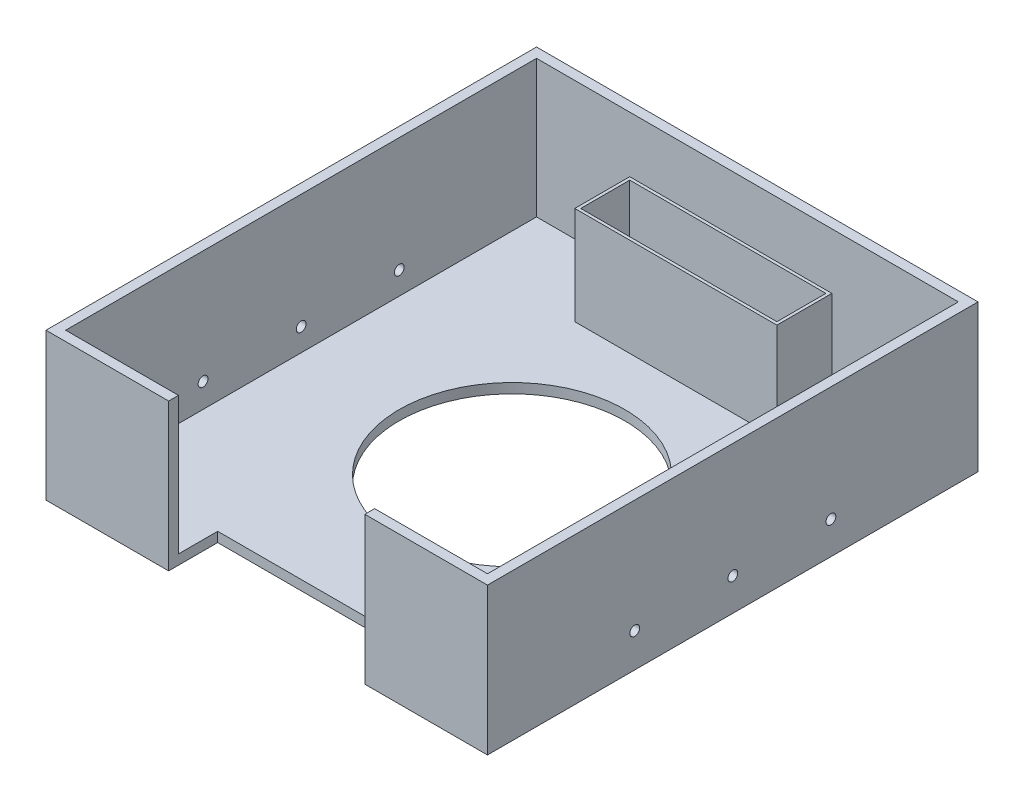
ISO-10303-21;
HEADER;
FILE_DESCRIPTION(('STEP AP214'),'2;1');
FILE_NAME('part.step','',(''),(''),'','','');
FILE_SCHEMA(('AUTOMOTIVE_DESIGN { 1 0 10303 214 1 1 1 1 }'));
ENDSEC;
DATA;
#1=APPLICATION_CONTEXT('core data for automotive mechanical design processes');
#2=APPLICATION_PROTOCOL_DEFINITION('international standard','automotive_design',2000,#1);
#3=PRODUCT_CONTEXT('',#1,'mechanical');
#4=PRODUCT('Part','Part','',(#3));
#5=PRODUCT_RELATED_PRODUCT_CATEGORY('part','',(#4));
#6=PRODUCT_DEFINITION_FORMATION('','',#4);
#7=PRODUCT_DEFINITION_CONTEXT('part definition',#1,'design');
#8=PRODUCT_DEFINITION('design','',#6,#7);
#9=PRODUCT_DEFINITION_SHAPE('','',#8);
#10=(LENGTH_UNIT() NAMED_UNIT(*) SI_UNIT(.MILLI.,.METRE.));
#11=(NAMED_UNIT(*) PLANE_ANGLE_UNIT() SI_UNIT($,.RADIAN.));
#12=(NAMED_UNIT(*) SI_UNIT($,.STERADIAN.) SOLID_ANGLE_UNIT());
#13=UNCERTAINTY_MEASURE_WITH_UNIT(LENGTH_MEASURE(1.E-05),#10,'distance_accuracy_value','');
#14=(GEOMETRIC_REPRESENTATION_CONTEXT(3) GLOBAL_UNCERTAINTY_ASSIGNED_CONTEXT((#13)) GLOBAL_UNIT_ASSIGNED_CONTEXT((#10,
#11,#12)) REPRESENTATION_CONTEXT('',''));
#15=CARTESIAN_POINT('',(0.,0.,0.));
#16=DIRECTION('',(0.,0.,1.));
#17=DIRECTION('',(1.,0.,0.));
#18=AXIS2_PLACEMENT_3D('',#15,#16,#17);
#19=CARTESIAN_POINT('',(0.,0.,0.));
#20=DIRECTION('',(0.,-1.,0.));
#21=DIRECTION('',(0.,0.,-1.));
#22=AXIS2_PLACEMENT_3D('',#19,#20,#21);
#23=PLANE('',#22);
#24=CARTESIAN_POINT('',(0.,0.,0.));
#25=DIRECTION('',(0.,1.,0.));
#26=DIRECTION('',(0.,0.,1.));
#27=AXIS2_PLACEMENT_3D('',#24,#25,#26);
#28=CIRCLE('',#27,115.);
#29=CARTESIAN_POINT('',(0.,0.,115.));
#30=VERTEX_POINT('',#29);
#31=EDGE_CURVE('E353',#30,#30,#28,.T.);
#32=ORIENTED_EDGE('',*,*,#31,.T.);
#33=EDGE_LOOP('',(#32));
#34=FACE_BOUND('',#33,.T.);
#35=DIRECTION('',(0.,0.,1.));
#36=VECTOR('',#35,1.);
#37=CARTESIAN_POINT('',(201.827871403571,0.,0.));
#38=LINE('',#37,#36);
#39=CARTESIAN_POINT('',(201.827871403571,0.,-145.964396687637));
#40=VERTEX_POINT('',#39);
#41=CARTESIAN_POINT('',(201.827871403571,0.,145.964396687637));
#42=VERTEX_POINT('',#41);
#43=EDGE_CURVE('E53',#40,#42,#38,.T.);
#44=ORIENTED_EDGE('',*,*,#43,.T.);
#45=DIRECTION('',(1.,0.,0.));
#46=VECTOR('',#45,1.);
#47=CARTESIAN_POINT('',(0.,0.,145.964396687637));
#48=LINE('',#47,#46);
#49=CARTESIAN_POINT('',(225.,0.,145.964396687637));
#50=VERTEX_POINT('',#49);
#51=EDGE_CURVE('E11',#42,#50,#48,.T.);
#52=ORIENTED_EDGE('',*,*,#51,.T.);
#53=DIRECTION('',(0.,0.,-1.));
#54=VECTOR('',#53,1.);
#55=CARTESIAN_POINT('',(225.,0.,250.));
#56=LINE('',#55,#54);
#57=CARTESIAN_POINT('',(225.,0.,250.));
#58=VERTEX_POINT('',#57);
#59=EDGE_CURVE('E405',#58,#50,#56,.T.);
#60=ORIENTED_EDGE('',*,*,#59,.F.);
#61=DIRECTION('',(1.,0.,0.));
#62=VECTOR('',#61,1.);
#63=CARTESIAN_POINT('',(-225.,0.,250.));
#64=LINE('',#63,#62);
#65=CARTESIAN_POINT('',(100.,0.,250.));
#66=VERTEX_POINT('',#65);
#67=EDGE_CURVE('E415',#66,#58,#64,.T.);
#68=ORIENTED_EDGE('',*,*,#67,.F.);
#69=DIRECTION('',(0.,0.,-1.));
#70=VECTOR('',#69,1.);
#71=CARTESIAN_POINT('',(100.,0.,300.));
#72=LINE('',#71,#70);
#73=CARTESIAN_POINT('',(100.,0.,200.));
#74=VERTEX_POINT('',#73);
#75=EDGE_CURVE('E325',#66,#74,#72,.T.);
#76=ORIENTED_EDGE('',*,*,#75,.T.);
#77=DIRECTION('',(-1.,0.,0.));
#78=VECTOR('',#77,1.);
#79=CARTESIAN_POINT('',(-100.,0.,200.));
#80=LINE('',#79,#78);
#81=CARTESIAN_POINT('',(-100.,0.,200.));
#82=VERTEX_POINT('',#81);
#83=EDGE_CURVE('E328',#74,#82,#80,.T.);
#84=ORIENTED_EDGE('',*,*,#83,.T.);
#85=DIRECTION('',(0.,0.,1.));
#86=VECTOR('',#85,1.);
#87=CARTESIAN_POINT('',(-100.,0.,300.));
#88=LINE('',#87,#86);
#89=CARTESIAN_POINT('',(-100.,0.,250.));
#90=VERTEX_POINT('',#89);
#91=EDGE_CURVE('E332',#82,#90,#88,.T.);
#92=ORIENTED_EDGE('',*,*,#91,.T.);
#93=CARTESIAN_POINT('',(-225.,0.,250.));
#94=VERTEX_POINT('',#93);
#95=EDGE_CURVE('E417',#94,#90,#64,.T.);
#96=ORIENTED_EDGE('',*,*,#95,.F.);
#97=DIRECTION('',(0.,0.,1.));
#98=VECTOR('',#97,1.);
#99=CARTESIAN_POINT('',(-225.,0.,250.));
#100=LINE('',#99,#98);
#101=CARTESIAN_POINT('',(-225.,0.,145.964396687637));
#102=VERTEX_POINT('',#101);
#103=EDGE_CURVE('E411',#102,#94,#100,.T.);
#104=ORIENTED_EDGE('',*,*,#103,.F.);
#105=DIRECTION('',(1.,0.,0.));
#106=VECTOR('',#105,1.);
#107=CARTESIAN_POINT('',(0.,0.,145.964396687637));
#108=LINE('',#107,#106);
#109=CARTESIAN_POINT('',(-201.827871403571,0.,145.964396687637));
#110=VERTEX_POINT('',#109);
#111=EDGE_CURVE('E447',#102,#110,#108,.T.);
#112=ORIENTED_EDGE('',*,*,#111,.T.);
#113=DIRECTION('',(0.,0.,-1.));
#114=VECTOR('',#113,1.);
#115=CARTESIAN_POINT('',(-201.827871403571,0.,0.));
#116=LINE('',#115,#114);
#117=CARTESIAN_POINT('',(-201.827871403571,0.,-145.964396687637));
#118=VERTEX_POINT('',#117);
#119=EDGE_CURVE('E444',#110,#118,#116,.T.);
#120=ORIENTED_EDGE('',*,*,#119,.T.);
#121=DIRECTION('',(-1.,0.,0.));
#122=VECTOR('',#121,1.);
#123=CARTESIAN_POINT('',(0.,0.,-145.964396687637));
#124=LINE('',#123,#122);
#125=CARTESIAN_POINT('',(-225.,0.,-145.964396687637));
#126=VERTEX_POINT('',#125);
#127=EDGE_CURVE('E441',#118,#126,#124,.T.);
#128=ORIENTED_EDGE('',*,*,#127,.T.);
#129=CARTESIAN_POINT('',(-225.,0.,-250.));
#130=VERTEX_POINT('',#129);
#131=EDGE_CURVE('E412',#130,#126,#100,.T.);
#132=ORIENTED_EDGE('',*,*,#131,.F.);
#133=DIRECTION('',(-1.,0.,0.));
#134=VECTOR('',#133,1.);
#135=CARTESIAN_POINT('',(-225.,0.,-250.));
#136=LINE('',#135,#134);
#137=CARTESIAN_POINT('',(225.,0.,-250.));
#138=VERTEX_POINT('',#137);
#139=EDGE_CURVE('E408',#138,#130,#136,.T.);
#140=ORIENTED_EDGE('',*,*,#139,.F.);
#141=CARTESIAN_POINT('',(225.,0.,-145.964396687637));
#142=VERTEX_POINT('',#141);
#143=EDGE_CURVE('E404',#142,#138,#56,.T.);
#144=ORIENTED_EDGE('',*,*,#143,.F.);
#145=DIRECTION('',(-1.,0.,0.));
#146=VECTOR('',#145,1.);
#147=CARTESIAN_POINT('',(0.,0.,-145.964396687637));
#148=LINE('',#147,#146);
#149=EDGE_CURVE('E450',#142,#40,#148,.T.);
#150=ORIENTED_EDGE('',*,*,#149,.T.);
#151=EDGE_LOOP('',(#44,#52,#60,#68,#76,#84,#92,#96,#104,#112,#120,#128,#132,#140,#144,#150));
#152=FACE_BOUND('',#151,.T.);
#153=ADVANCED_FACE('F44',(#34,#152),#23,.T.);
#154=ORIENTED_EDGE('',*,*,#51,.F.);
#155=ORIENTED_EDGE('',*,*,#43,.F.);
#156=ORIENTED_EDGE('',*,*,#149,.F.);
#157=EDGE_CURVE('E409',#50,#142,#56,.T.);
#158=ORIENTED_EDGE('',*,*,#157,.F.);
#159=EDGE_LOOP('',(#154,#155,#156,#158));
#160=FACE_BOUND('',#159,.T.);
#161=ADVANCED_FACE('F460',(#160),#23,.T.);
#162=CARTESIAN_POINT('',(0.,10.,0.));
#163=DIRECTION('',(0.,-1.,0.));
#164=DIRECTION('',(0.,0.,-1.));
#165=AXIS2_PLACEMENT_3D('',#162,#163,#164);
#166=PLANE('',#165);
#167=CARTESIAN_POINT('',(0.,10.,0.));
#168=DIRECTION('',(0.,1.,0.));
#169=DIRECTION('',(0.,0.,1.));
#170=AXIS2_PLACEMENT_3D('',#167,#168,#169);
#171=CIRCLE('',#170,115.);
#172=CARTESIAN_POINT('',(0.,10.,115.));
#173=VERTEX_POINT('',#172);
#174=EDGE_CURVE('E352',#173,#173,#171,.T.);
#175=ORIENTED_EDGE('',*,*,#174,.F.);
#176=EDGE_LOOP('',(#175));
#177=FACE_BOUND('',#176,.T.);
#178=DIRECTION('',(1.,0.,0.));
#179=VECTOR('',#178,1.);
#180=CARTESIAN_POINT('',(0.,10.,200.));
#181=LINE('',#180,#179);
#182=CARTESIAN_POINT('',(-100.,10.,200.));
#183=VERTEX_POINT('',#182);
#184=CARTESIAN_POINT('',(100.,10.,200.));
#185=VERTEX_POINT('',#184);
#186=EDGE_CURVE('E432',#183,#185,#181,.T.);
#187=ORIENTED_EDGE('',*,*,#186,.T.);
#188=DIRECTION('',(0.,0.,1.));
#189=VECTOR('',#188,1.);
#190=CARTESIAN_POINT('',(100.,10.,0.));
#191=LINE('',#190,#189);
#192=CARTESIAN_POINT('',(100.,10.,240.));
#193=VERTEX_POINT('',#192);
#194=EDGE_CURVE('E438',#185,#193,#191,.T.);
#195=ORIENTED_EDGE('',*,*,#194,.T.);
#196=DIRECTION('',(1.,0.,0.));
#197=VECTOR('',#196,1.);
#198=CARTESIAN_POINT('',(-215.,10.,240.));
#199=LINE('',#198,#197);
#200=CARTESIAN_POINT('',(215.,10.,240.));
#201=VERTEX_POINT('',#200);
#202=EDGE_CURVE('E356',#193,#201,#199,.T.);
#203=ORIENTED_EDGE('',*,*,#202,.T.);
#204=DIRECTION('',(0.,0.,-1.));
#205=VECTOR('',#204,1.);
#206=CARTESIAN_POINT('',(215.,10.,240.));
#207=LINE('',#206,#205);
#208=CARTESIAN_POINT('',(215.,10.,-240.));
#209=VERTEX_POINT('',#208);
#210=EDGE_CURVE('E374',#201,#209,#207,.T.);
#211=ORIENTED_EDGE('',*,*,#210,.T.);
#212=DIRECTION('',(-1.,0.,0.));
#213=VECTOR('',#212,1.);
#214=CARTESIAN_POINT('',(215.,10.,-240.));
#215=LINE('',#214,#213);
#216=CARTESIAN_POINT('',(-215.,10.,-240.));
#217=VERTEX_POINT('',#216);
#218=EDGE_CURVE('E377',#209,#217,#215,.T.);
#219=ORIENTED_EDGE('',*,*,#218,.T.);
#220=DIRECTION('',(0.,0.,1.));
#221=VECTOR('',#220,1.);
#222=CARTESIAN_POINT('',(-215.,10.,-240.));
#223=LINE('',#222,#221);
#224=CARTESIAN_POINT('',(-215.,10.,240.));
#225=VERTEX_POINT('',#224);
#226=EDGE_CURVE('E380',#217,#225,#223,.T.);
#227=ORIENTED_EDGE('',*,*,#226,.T.);
#228=CARTESIAN_POINT('',(-100.,10.,240.));
#229=VERTEX_POINT('',#228);
#230=EDGE_CURVE('E371',#225,#229,#199,.T.);
#231=ORIENTED_EDGE('',*,*,#230,.T.);
#232=DIRECTION('',(0.,0.,-1.));
#233=VECTOR('',#232,1.);
#234=CARTESIAN_POINT('',(-100.,10.,0.));
#235=LINE('',#234,#233);
#236=EDGE_CURVE('E435',#229,#183,#235,.T.);
#237=ORIENTED_EDGE('',*,*,#236,.T.);
#238=EDGE_LOOP('',(#187,#195,#203,#211,#219,#227,#231,#237));
#239=FACE_BOUND('',#238,.T.);
#240=DIRECTION('',(0.,0.,1.));
#241=VECTOR('',#240,1.);
#242=CARTESIAN_POINT('',(-103.,10.,-223.));
#243=LINE('',#242,#241);
#244=CARTESIAN_POINT('',(-103.,10.,-223.));
#245=VERTEX_POINT('',#244);
#246=CARTESIAN_POINT('',(-103.,10.,-167.));
#247=VERTEX_POINT('',#246);
#248=EDGE_CURVE('E232',#245,#247,#243,.T.);
#249=ORIENTED_EDGE('',*,*,#248,.F.);
#250=DIRECTION('',(-1.,0.,0.));
#251=VECTOR('',#250,1.);
#252=CARTESIAN_POINT('',(-103.,10.,-223.));
#253=LINE('',#252,#251);
#254=CARTESIAN_POINT('',(103.,10.,-223.));
#255=VERTEX_POINT('',#254);
#256=EDGE_CURVE('E260',#255,#245,#253,.T.);
#257=ORIENTED_EDGE('',*,*,#256,.F.);
#258=DIRECTION('',(0.,0.,-1.));
#259=VECTOR('',#258,1.);
#260=CARTESIAN_POINT('',(103.,10.,-223.));
#261=LINE('',#260,#259);
#262=CARTESIAN_POINT('',(103.,10.,-167.));
#263=VERTEX_POINT('',#262);
#264=EDGE_CURVE('E272',#263,#255,#261,.T.);
#265=ORIENTED_EDGE('',*,*,#264,.F.);
#266=DIRECTION('',(1.,0.,0.));
#267=VECTOR('',#266,1.);
#268=CARTESIAN_POINT('',(-103.,10.,-167.));
#269=LINE('',#268,#267);
#270=EDGE_CURVE('E269',#247,#263,#269,.T.);
#271=ORIENTED_EDGE('',*,*,#270,.F.);
#272=EDGE_LOOP('',(#249,#257,#265,#271));
#273=FACE_BOUND('',#272,.T.);
#274=ADVANCED_FACE('F487',(#177,#239,#273),#166,.F.);
#275=CARTESIAN_POINT('',(-225.,10.,250.));
#276=DIRECTION('',(0.,0.,-1.));
#277=DIRECTION('',(-1.,0.,0.));
#278=AXIS2_PLACEMENT_3D('',#275,#276,#277);
#279=PLANE('',#278);
#280=DIRECTION('',(1.,0.,0.));
#281=VECTOR('',#280,1.);
#282=CARTESIAN_POINT('',(-225.,150.,250.));
#283=LINE('',#282,#281);
#284=CARTESIAN_POINT('',(100.,150.,250.));
#285=VERTEX_POINT('',#284);
#286=CARTESIAN_POINT('',(225.,150.,250.));
#287=VERTEX_POINT('',#286);
#288=EDGE_CURVE('E391',#285,#287,#283,.T.);
#289=ORIENTED_EDGE('',*,*,#288,.F.);
#290=DIRECTION('',(0.,-1.,0.));
#291=VECTOR('',#290,1.);
#292=CARTESIAN_POINT('',(99.9999999999999,10.,250.));
#293=LINE('',#292,#291);
#294=EDGE_CURVE('E349',#285,#66,#293,.T.);
#295=ORIENTED_EDGE('',*,*,#294,.T.);
#296=ORIENTED_EDGE('',*,*,#67,.T.);
#297=DIRECTION('',(0.,-1.,0.));
#298=VECTOR('',#297,1.);
#299=CARTESIAN_POINT('',(225.,10.,250.));
#300=LINE('',#299,#298);
#301=EDGE_CURVE('E420',#287,#58,#300,.T.);
#302=ORIENTED_EDGE('',*,*,#301,.F.);
#303=EDGE_LOOP('',(#289,#295,#296,#302));
#304=FACE_BOUND('',#303,.T.);
#305=ADVANCED_FACE('F467',(#304),#279,.F.);
#306=CARTESIAN_POINT('',(-215.,150.,240.));
#307=DIRECTION('',(0.,0.,-1.));
#308=DIRECTION('',(-1.,0.,0.));
#309=AXIS2_PLACEMENT_3D('',#306,#307,#308);
#310=PLANE('',#309);
#311=DIRECTION('',(0.,-1.,0.));
#312=VECTOR('',#311,1.);
#313=CARTESIAN_POINT('',(99.9999999999999,150.,240.));
#314=LINE('',#313,#312);
#315=CARTESIAN_POINT('',(100.,150.,240.));
#316=VERTEX_POINT('',#315);
#317=EDGE_CURVE('E347',#316,#193,#314,.T.);
#318=ORIENTED_EDGE('',*,*,#317,.F.);
#319=DIRECTION('',(1.,0.,0.));
#320=VECTOR('',#319,1.);
#321=CARTESIAN_POINT('',(-215.,150.,240.));
#322=LINE('',#321,#320);
#323=CARTESIAN_POINT('',(215.,150.,240.));
#324=VERTEX_POINT('',#323);
#325=EDGE_CURVE('E363',#316,#324,#322,.T.);
#326=ORIENTED_EDGE('',*,*,#325,.T.);
#327=DIRECTION('',(0.,-1.,0.));
#328=VECTOR('',#327,1.);
#329=CARTESIAN_POINT('',(215.,150.,240.));
#330=LINE('',#329,#328);
#331=EDGE_CURVE('E388',#324,#201,#330,.T.);
#332=ORIENTED_EDGE('',*,*,#331,.T.);
#333=ORIENTED_EDGE('',*,*,#202,.F.);
#334=EDGE_LOOP('',(#318,#326,#332,#333));
#335=FACE_BOUND('',#334,.T.);
#336=ADVANCED_FACE('F479',(#335),#310,.T.);
#337=CARTESIAN_POINT('',(225.,10.,250.));
#338=DIRECTION('',(-1.,0.,0.));
#339=DIRECTION('',(0.,0.,1.));
#340=AXIS2_PLACEMENT_3D('',#337,#338,#339);
#341=PLANE('',#340);
#342=CARTESIAN_POINT('',(225.,34.7,99.9));
#343=DIRECTION('',(1.,0.,0.));
#344=DIRECTION('',(0.,0.,-1.));
#345=AXIS2_PLACEMENT_3D('',#342,#343,#344);
#346=CIRCLE('',#345,5.00000000000001);
#347=CARTESIAN_POINT('',(225.,34.7,94.9));
#348=VERTEX_POINT('',#347);
#349=EDGE_CURVE('E311',#348,#348,#346,.T.);
#350=ORIENTED_EDGE('',*,*,#349,.F.);
#351=EDGE_LOOP('',(#350));
#352=FACE_BOUND('',#351,.T.);
#353=CARTESIAN_POINT('',(225.,33.13,-0.100000000000017));
#354=DIRECTION('',(1.,0.,0.));
#355=DIRECTION('',(0.,0.,-1.));
#356=AXIS2_PLACEMENT_3D('',#353,#354,#355);
#357=CIRCLE('',#356,5.);
#358=CARTESIAN_POINT('',(225.,33.13,-5.10000000000002));
#359=VERTEX_POINT('',#358);
#360=EDGE_CURVE('E317',#359,#359,#357,.T.);
#361=ORIENTED_EDGE('',*,*,#360,.F.);
#362=EDGE_LOOP('',(#361));
#363=FACE_BOUND('',#362,.T.);
#364=CARTESIAN_POINT('',(225.,33.13,-100.1));
#365=DIRECTION('',(1.,0.,0.));
#366=DIRECTION('',(0.,0.,-1.));
#367=AXIS2_PLACEMENT_3D('',#364,#365,#366);
#368=CIRCLE('',#367,5.00000000000001);
#369=CARTESIAN_POINT('',(225.,33.13,-105.1));
#370=VERTEX_POINT('',#369);
#371=EDGE_CURVE('E304',#370,#370,#368,.T.);
#372=ORIENTED_EDGE('',*,*,#371,.F.);
#373=EDGE_LOOP('',(#372));
#374=FACE_BOUND('',#373,.T.);
#375=ORIENTED_EDGE('',*,*,#59,.T.);
#376=ORIENTED_EDGE('',*,*,#157,.T.);
#377=ORIENTED_EDGE('',*,*,#143,.T.);
#378=DIRECTION('',(0.,-1.,0.));
#379=VECTOR('',#378,1.);
#380=CARTESIAN_POINT('',(225.,10.,-250.));
#381=LINE('',#380,#379);
#382=CARTESIAN_POINT('',(225.,150.,-250.));
#383=VERTEX_POINT('',#382);
#384=EDGE_CURVE('E429',#383,#138,#381,.T.);
#385=ORIENTED_EDGE('',*,*,#384,.F.);
#386=DIRECTION('',(0.,0.,-1.));
#387=VECTOR('',#386,1.);
#388=CARTESIAN_POINT('',(225.,150.,250.));
#389=LINE('',#388,#387);
#390=EDGE_CURVE('E395',#287,#383,#389,.T.);
#391=ORIENTED_EDGE('',*,*,#390,.F.);
#392=ORIENTED_EDGE('',*,*,#301,.T.);
#393=EDGE_LOOP('',(#375,#376,#377,#385,#391,#392));
#394=FACE_BOUND('',#393,.T.);
#395=ADVANCED_FACE('F46',(#352,#363,#374,#394),#341,.F.);
#396=CARTESIAN_POINT('',(-225.,10.,-250.));
#397=DIRECTION('',(0.,0.,1.));
#398=DIRECTION('',(1.,0.,0.));
#399=AXIS2_PLACEMENT_3D('',#396,#397,#398);
#400=PLANE('',#399);
#401=ORIENTED_EDGE('',*,*,#139,.T.);
#402=DIRECTION('',(0.,-1.,0.));
#403=VECTOR('',#402,1.);
#404=CARTESIAN_POINT('',(-225.,10.,-250.));
#405=LINE('',#404,#403);
#406=CARTESIAN_POINT('',(-225.,150.,-250.));
#407=VERTEX_POINT('',#406);
#408=EDGE_CURVE('E426',#407,#130,#405,.T.);
#409=ORIENTED_EDGE('',*,*,#408,.F.);
#410=DIRECTION('',(-1.,0.,0.));
#411=VECTOR('',#410,1.);
#412=CARTESIAN_POINT('',(225.,150.,-250.));
#413=LINE('',#412,#411);
#414=EDGE_CURVE('E398',#383,#407,#413,.T.);
#415=ORIENTED_EDGE('',*,*,#414,.F.);
#416=ORIENTED_EDGE('',*,*,#384,.T.);
#417=EDGE_LOOP('',(#401,#409,#415,#416));
#418=FACE_BOUND('',#417,.T.);
#419=ADVANCED_FACE('F507',(#418),#400,.F.);
#420=CARTESIAN_POINT('',(-225.,10.,250.));
#421=DIRECTION('',(1.,0.,0.));
#422=DIRECTION('',(0.,0.,-1.));
#423=AXIS2_PLACEMENT_3D('',#420,#421,#422);
#424=PLANE('',#423);
#425=CARTESIAN_POINT('',(-225.,33.13,-100.1));
#426=DIRECTION('',(-1.,0.,0.));
#427=DIRECTION('',(0.,0.,1.));
#428=AXIS2_PLACEMENT_3D('',#425,#426,#427);
#429=CIRCLE('',#428,5.00000000000001);
#430=CARTESIAN_POINT('',(-225.,33.13,-95.1));
#431=VERTEX_POINT('',#430);
#432=EDGE_CURVE('E288',#431,#431,#429,.T.);
#433=ORIENTED_EDGE('',*,*,#432,.F.);
#434=EDGE_LOOP('',(#433));
#435=FACE_BOUND('',#434,.T.);
#436=CARTESIAN_POINT('',(-225.,34.7,99.9));
#437=DIRECTION('',(-1.,0.,0.));
#438=DIRECTION('',(0.,0.,1.));
#439=AXIS2_PLACEMENT_3D('',#436,#437,#438);
#440=CIRCLE('',#439,5.00000000000001);
#441=CARTESIAN_POINT('',(-225.,34.7,104.9));
#442=VERTEX_POINT('',#441);
#443=EDGE_CURVE('E293',#442,#442,#440,.T.);
#444=ORIENTED_EDGE('',*,*,#443,.F.);
#445=EDGE_LOOP('',(#444));
#446=FACE_BOUND('',#445,.T.);
#447=CARTESIAN_POINT('',(-225.,33.13,-0.100000000000017));
#448=DIRECTION('',(-1.,0.,0.));
#449=DIRECTION('',(0.,0.,1.));
#450=AXIS2_PLACEMENT_3D('',#447,#448,#449);
#451=CIRCLE('',#450,5.00000000000001);
#452=CARTESIAN_POINT('',(-225.,33.13,4.89999999999999));
#453=VERTEX_POINT('',#452);
#454=EDGE_CURVE('E292',#453,#453,#451,.T.);
#455=ORIENTED_EDGE('',*,*,#454,.F.);
#456=EDGE_LOOP('',(#455));
#457=FACE_BOUND('',#456,.T.);
#458=ORIENTED_EDGE('',*,*,#131,.T.);
#459=EDGE_CURVE('E416',#126,#102,#100,.T.);
#460=ORIENTED_EDGE('',*,*,#459,.T.);
#461=ORIENTED_EDGE('',*,*,#103,.T.);
#462=DIRECTION('',(0.,-1.,0.));
#463=VECTOR('',#462,1.);
#464=CARTESIAN_POINT('',(-225.,10.,250.));
#465=LINE('',#464,#463);
#466=CARTESIAN_POINT('',(-225.,150.,250.));
#467=VERTEX_POINT('',#466);
#468=EDGE_CURVE('E423',#467,#94,#465,.T.);
#469=ORIENTED_EDGE('',*,*,#468,.F.);
#470=DIRECTION('',(0.,0.,1.));
#471=VECTOR('',#470,1.);
#472=CARTESIAN_POINT('',(-225.,150.,-250.));
#473=LINE('',#472,#471);
#474=EDGE_CURVE('E401',#407,#467,#473,.T.);
#475=ORIENTED_EDGE('',*,*,#474,.F.);
#476=ORIENTED_EDGE('',*,*,#408,.T.);
#477=EDGE_LOOP('',(#458,#460,#461,#469,#475,#476));
#478=FACE_BOUND('',#477,.T.);
#479=ADVANCED_FACE('F502',(#435,#446,#457,#478),#424,.F.);
#480=ORIENTED_EDGE('',*,*,#95,.T.);
#481=DIRECTION('',(0.,1.,0.));
#482=VECTOR('',#481,1.);
#483=CARTESIAN_POINT('',(-100.,10.,250.));
#484=LINE('',#483,#482);
#485=CARTESIAN_POINT('',(-100.,150.,250.));
#486=VERTEX_POINT('',#485);
#487=EDGE_CURVE('E344',#90,#486,#484,.T.);
#488=ORIENTED_EDGE('',*,*,#487,.T.);
#489=EDGE_CURVE('E392',#467,#486,#283,.T.);
#490=ORIENTED_EDGE('',*,*,#489,.F.);
#491=ORIENTED_EDGE('',*,*,#468,.T.);
#492=EDGE_LOOP('',(#480,#488,#490,#491));
#493=FACE_BOUND('',#492,.T.);
#494=ADVANCED_FACE('F498',(#493),#279,.F.);
#495=ORIENTED_EDGE('',*,*,#111,.F.);
#496=ORIENTED_EDGE('',*,*,#459,.F.);
#497=ORIENTED_EDGE('',*,*,#127,.F.);
#498=ORIENTED_EDGE('',*,*,#119,.F.);
#499=EDGE_LOOP('',(#495,#496,#497,#498));
#500=FACE_BOUND('',#499,.T.);
#501=ADVANCED_FACE('F513',(#500),#23,.T.);
#502=CARTESIAN_POINT('',(0.,150.,0.));
#503=DIRECTION('',(0.,1.,0.));
#504=DIRECTION('',(0.,0.,1.));
#505=AXIS2_PLACEMENT_3D('',#502,#503,#504);
#506=PLANE('',#505);
#507=DIRECTION('',(0.,0.,-1.));
#508=VECTOR('',#507,1.);
#509=CARTESIAN_POINT('',(100.,150.,300.));
#510=LINE('',#509,#508);
#511=EDGE_CURVE('E310',#285,#316,#510,.T.);
#512=ORIENTED_EDGE('',*,*,#511,.F.);
#513=ORIENTED_EDGE('',*,*,#288,.T.);
#514=ORIENTED_EDGE('',*,*,#390,.T.);
#515=ORIENTED_EDGE('',*,*,#414,.T.);
#516=ORIENTED_EDGE('',*,*,#474,.T.);
#517=ORIENTED_EDGE('',*,*,#489,.T.);
#518=DIRECTION('',(0.,0.,1.));
#519=VECTOR('',#518,1.);
#520=CARTESIAN_POINT('',(-100.,150.,300.));
#521=LINE('',#520,#519);
#522=CARTESIAN_POINT('',(-100.,150.,240.));
#523=VERTEX_POINT('',#522);
#524=EDGE_CURVE('E329',#523,#486,#521,.T.);
#525=ORIENTED_EDGE('',*,*,#524,.F.);
#526=CARTESIAN_POINT('',(-215.,150.,240.));
#527=VERTEX_POINT('',#526);
#528=EDGE_CURVE('E359',#527,#523,#322,.T.);
#529=ORIENTED_EDGE('',*,*,#528,.F.);
#530=DIRECTION('',(0.,0.,1.));
#531=VECTOR('',#530,1.);
#532=CARTESIAN_POINT('',(-215.,150.,-240.));
#533=LINE('',#532,#531);
#534=CARTESIAN_POINT('',(-215.,150.,-240.));
#535=VERTEX_POINT('',#534);
#536=EDGE_CURVE('E368',#535,#527,#533,.T.);
#537=ORIENTED_EDGE('',*,*,#536,.F.);
#538=DIRECTION('',(-1.,0.,0.));
#539=VECTOR('',#538,1.);
#540=CARTESIAN_POINT('',(215.,150.,-240.));
#541=LINE('',#540,#539);
#542=CARTESIAN_POINT('',(215.,150.,-240.));
#543=VERTEX_POINT('',#542);
#544=EDGE_CURVE('E365',#543,#535,#541,.T.);
#545=ORIENTED_EDGE('',*,*,#544,.F.);
#546=DIRECTION('',(0.,0.,-1.));
#547=VECTOR('',#546,1.);
#548=CARTESIAN_POINT('',(215.,150.,240.));
#549=LINE('',#548,#547);
#550=EDGE_CURVE('E362',#324,#543,#549,.T.);
#551=ORIENTED_EDGE('',*,*,#550,.F.);
#552=ORIENTED_EDGE('',*,*,#325,.F.);
#553=EDGE_LOOP('',(#512,#513,#514,#515,#516,#517,#525,#529,#537,#545,#551,#552));
#554=FACE_BOUND('',#553,.T.);
#555=ADVANCED_FACE('F474',(#554),#506,.T.);
#556=DIRECTION('',(0.,1.,0.));
#557=VECTOR('',#556,1.);
#558=CARTESIAN_POINT('',(-100.,150.,240.));
#559=LINE('',#558,#557);
#560=EDGE_CURVE('E341',#229,#523,#559,.T.);
#561=ORIENTED_EDGE('',*,*,#560,.F.);
#562=ORIENTED_EDGE('',*,*,#230,.F.);
#563=DIRECTION('',(0.,-1.,0.));
#564=VECTOR('',#563,1.);
#565=CARTESIAN_POINT('',(-215.,150.,240.));
#566=LINE('',#565,#564);
#567=EDGE_CURVE('E370',#527,#225,#566,.T.);
#568=ORIENTED_EDGE('',*,*,#567,.F.);
#569=ORIENTED_EDGE('',*,*,#528,.T.);
#570=EDGE_LOOP('',(#561,#562,#568,#569));
#571=FACE_BOUND('',#570,.T.);
#572=ADVANCED_FACE('F520',(#571),#310,.T.);
#573=CARTESIAN_POINT('',(215.,150.,240.));
#574=DIRECTION('',(-1.,0.,0.));
#575=DIRECTION('',(0.,0.,1.));
#576=AXIS2_PLACEMENT_3D('',#573,#574,#575);
#577=PLANE('',#576);
#578=CARTESIAN_POINT('',(215.,34.7,99.9));
#579=DIRECTION('',(1.,0.,0.));
#580=DIRECTION('',(0.,0.,-1.));
#581=AXIS2_PLACEMENT_3D('',#578,#579,#580);
#582=CIRCLE('',#581,5.00000000000001);
#583=CARTESIAN_POINT('',(215.,34.7,94.9));
#584=VERTEX_POINT('',#583);
#585=EDGE_CURVE('E307',#584,#584,#582,.T.);
#586=ORIENTED_EDGE('',*,*,#585,.T.);
#587=EDGE_LOOP('',(#586));
#588=FACE_BOUND('',#587,.T.);
#589=CARTESIAN_POINT('',(215.,33.13,-0.100000000000017));
#590=DIRECTION('',(1.,0.,0.));
#591=DIRECTION('',(0.,0.,-1.));
#592=AXIS2_PLACEMENT_3D('',#589,#590,#591);
#593=CIRCLE('',#592,5.);
#594=CARTESIAN_POINT('',(215.,33.13,-5.10000000000002));
#595=VERTEX_POINT('',#594);
#596=EDGE_CURVE('E314',#595,#595,#593,.T.);
#597=ORIENTED_EDGE('',*,*,#596,.T.);
#598=EDGE_LOOP('',(#597));
#599=FACE_BOUND('',#598,.T.);
#600=CARTESIAN_POINT('',(215.,33.13,-100.1));
#601=DIRECTION('',(1.,0.,0.));
#602=DIRECTION('',(0.,0.,-1.));
#603=AXIS2_PLACEMENT_3D('',#600,#601,#602);
#604=CIRCLE('',#603,5.00000000000001);
#605=CARTESIAN_POINT('',(215.,33.13,-105.1));
#606=VERTEX_POINT('',#605);
#607=EDGE_CURVE('E320',#606,#606,#604,.T.);
#608=ORIENTED_EDGE('',*,*,#607,.T.);
#609=EDGE_LOOP('',(#608));
#610=FACE_BOUND('',#609,.T.);
#611=ORIENTED_EDGE('',*,*,#210,.F.);
#612=ORIENTED_EDGE('',*,*,#331,.F.);
#613=ORIENTED_EDGE('',*,*,#550,.T.);
#614=DIRECTION('',(0.,-1.,0.));
#615=VECTOR('',#614,1.);
#616=CARTESIAN_POINT('',(215.,150.,-240.));
#617=LINE('',#616,#615);
#618=EDGE_CURVE('E386',#543,#209,#617,.T.);
#619=ORIENTED_EDGE('',*,*,#618,.T.);
#620=EDGE_LOOP('',(#611,#612,#613,#619));
#621=FACE_BOUND('',#620,.T.);
#622=ADVANCED_FACE('F483',(#588,#599,#610,#621),#577,.T.);
#623=CARTESIAN_POINT('',(215.,150.,-240.));
#624=DIRECTION('',(0.,0.,1.));
#625=DIRECTION('',(1.,0.,0.));
#626=AXIS2_PLACEMENT_3D('',#623,#624,#625);
#627=PLANE('',#626);
#628=ORIENTED_EDGE('',*,*,#218,.F.);
#629=ORIENTED_EDGE('',*,*,#618,.F.);
#630=ORIENTED_EDGE('',*,*,#544,.T.);
#631=DIRECTION('',(0.,-1.,0.));
#632=VECTOR('',#631,1.);
#633=CARTESIAN_POINT('',(-215.,150.,-240.));
#634=LINE('',#633,#632);
#635=EDGE_CURVE('E384',#535,#217,#634,.T.);
#636=ORIENTED_EDGE('',*,*,#635,.T.);
#637=EDGE_LOOP('',(#628,#629,#630,#636));
#638=FACE_BOUND('',#637,.T.);
#639=ADVANCED_FACE('F612',(#638),#627,.T.);
#640=CARTESIAN_POINT('',(-215.,150.,-240.));
#641=DIRECTION('',(1.,0.,0.));
#642=DIRECTION('',(0.,0.,-1.));
#643=AXIS2_PLACEMENT_3D('',#640,#641,#642);
#644=PLANE('',#643);
#645=CARTESIAN_POINT('',(-215.,33.13,-100.1));
#646=DIRECTION('',(-1.,0.,0.));
#647=DIRECTION('',(0.,0.,1.));
#648=AXIS2_PLACEMENT_3D('',#645,#646,#647);
#649=CIRCLE('',#648,5.00000000000001);
#650=CARTESIAN_POINT('',(-215.,33.13,-95.1));
#651=VERTEX_POINT('',#650);
#652=EDGE_CURVE('E296',#651,#651,#649,.T.);
#653=ORIENTED_EDGE('',*,*,#652,.T.);
#654=EDGE_LOOP('',(#653));
#655=FACE_BOUND('',#654,.T.);
#656=CARTESIAN_POINT('',(-215.,34.7,99.9));
#657=DIRECTION('',(-1.,0.,0.));
#658=DIRECTION('',(0.,0.,1.));
#659=AXIS2_PLACEMENT_3D('',#656,#657,#658);
#660=CIRCLE('',#659,5.00000000000001);
#661=CARTESIAN_POINT('',(-215.,34.7,104.9));
#662=VERTEX_POINT('',#661);
#663=EDGE_CURVE('E289',#662,#662,#660,.T.);
#664=ORIENTED_EDGE('',*,*,#663,.T.);
#665=EDGE_LOOP('',(#664));
#666=FACE_BOUND('',#665,.T.);
#667=CARTESIAN_POINT('',(-215.,33.13,-0.100000000000017));
#668=DIRECTION('',(-1.,0.,0.));
#669=DIRECTION('',(0.,0.,1.));
#670=AXIS2_PLACEMENT_3D('',#667,#668,#669);
#671=CIRCLE('',#670,5.00000000000001);
#672=CARTESIAN_POINT('',(-215.,33.13,4.89999999999999));
#673=VERTEX_POINT('',#672);
#674=EDGE_CURVE('E301',#673,#673,#671,.T.);
#675=ORIENTED_EDGE('',*,*,#674,.T.);
#676=EDGE_LOOP('',(#675));
#677=FACE_BOUND('',#676,.T.);
#678=ORIENTED_EDGE('',*,*,#226,.F.);
#679=ORIENTED_EDGE('',*,*,#635,.F.);
#680=ORIENTED_EDGE('',*,*,#536,.T.);
#681=ORIENTED_EDGE('',*,*,#567,.T.);
#682=EDGE_LOOP('',(#678,#679,#680,#681));
#683=FACE_BOUND('',#682,.T.);
#684=ADVANCED_FACE('F608',(#655,#666,#677,#683),#644,.T.);
#685=CARTESIAN_POINT('',(0.,0.,0.));
#686=DIRECTION('',(0.,1.,0.));
#687=DIRECTION('',(0.,0.,1.));
#688=AXIS2_PLACEMENT_3D('',#685,#686,#687);
#689=CYLINDRICAL_SURFACE('',#688,115.);
#690=ORIENTED_EDGE('',*,*,#31,.F.);
#691=EDGE_LOOP('',(#690));
#692=FACE_BOUND('',#691,.T.);
#693=ORIENTED_EDGE('',*,*,#174,.T.);
#694=EDGE_LOOP('',(#693));
#695=FACE_BOUND('',#694,.T.);
#696=ADVANCED_FACE('F605',(#692,#695),#689,.F.);
#697=CARTESIAN_POINT('',(100.,0.,300.));
#698=DIRECTION('',(1.,0.,0.));
#699=DIRECTION('',(0.,0.,-1.));
#700=AXIS2_PLACEMENT_3D('',#697,#698,#699);
#701=PLANE('',#700);
#702=ORIENTED_EDGE('',*,*,#511,.T.);
#703=ORIENTED_EDGE('',*,*,#317,.T.);
#704=ORIENTED_EDGE('',*,*,#194,.F.);
#705=DIRECTION('',(0.,1.,0.));
#706=VECTOR('',#705,1.);
#707=CARTESIAN_POINT('',(100.,0.,200.));
#708=LINE('',#707,#706);
#709=EDGE_CURVE('E335',#74,#185,#708,.T.);
#710=ORIENTED_EDGE('',*,*,#709,.F.);
#711=ORIENTED_EDGE('',*,*,#75,.F.);
#712=ORIENTED_EDGE('',*,*,#294,.F.);
#713=EDGE_LOOP('',(#702,#703,#704,#710,#711,#712));
#714=FACE_BOUND('',#713,.T.);
#715=ADVANCED_FACE('F470',(#714),#701,.F.);
#716=CARTESIAN_POINT('',(-100.,0.,300.));
#717=DIRECTION('',(-1.,0.,0.));
#718=DIRECTION('',(0.,0.,1.));
#719=AXIS2_PLACEMENT_3D('',#716,#717,#718);
#720=PLANE('',#719);
#721=ORIENTED_EDGE('',*,*,#91,.F.);
#722=DIRECTION('',(0.,1.,0.));
#723=VECTOR('',#722,1.);
#724=CARTESIAN_POINT('',(-100.,0.,200.));
#725=LINE('',#724,#723);
#726=EDGE_CURVE('E338',#82,#183,#725,.T.);
#727=ORIENTED_EDGE('',*,*,#726,.T.);
#728=ORIENTED_EDGE('',*,*,#236,.F.);
#729=ORIENTED_EDGE('',*,*,#560,.T.);
#730=ORIENTED_EDGE('',*,*,#524,.T.);
#731=ORIENTED_EDGE('',*,*,#487,.F.);
#732=EDGE_LOOP('',(#721,#727,#728,#729,#730,#731));
#733=FACE_BOUND('',#732,.T.);
#734=ADVANCED_FACE('F598',(#733),#720,.F.);
#735=CARTESIAN_POINT('',(-100.,0.,200.));
#736=DIRECTION('',(0.,0.,-1.));
#737=DIRECTION('',(-1.,0.,0.));
#738=AXIS2_PLACEMENT_3D('',#735,#736,#737);
#739=PLANE('',#738);
#740=ORIENTED_EDGE('',*,*,#726,.F.);
#741=ORIENTED_EDGE('',*,*,#83,.F.);
#742=ORIENTED_EDGE('',*,*,#709,.T.);
#743=ORIENTED_EDGE('',*,*,#186,.F.);
#744=EDGE_LOOP('',(#740,#741,#742,#743));
#745=FACE_BOUND('',#744,.T.);
#746=ADVANCED_FACE('F492',(#745),#739,.F.);
#747=CARTESIAN_POINT('',(215.,33.13,-100.1));
#748=DIRECTION('',(1.,0.,0.));
#749=DIRECTION('',(0.,0.,-1.));
#750=AXIS2_PLACEMENT_3D('',#747,#748,#749);
#751=CYLINDRICAL_SURFACE('',#750,5.00000000000001);
#752=ORIENTED_EDGE('',*,*,#607,.F.);
#753=EDGE_LOOP('',(#752));
#754=FACE_BOUND('',#753,.T.);
#755=ORIENTED_EDGE('',*,*,#371,.T.);
#756=EDGE_LOOP('',(#755));
#757=FACE_BOUND('',#756,.T.);
#758=ADVANCED_FACE('F593',(#754,#757),#751,.F.);
#759=CARTESIAN_POINT('',(215.,33.13,-0.100000000000017));
#760=DIRECTION('',(1.,0.,0.));
#761=DIRECTION('',(0.,0.,-1.));
#762=AXIS2_PLACEMENT_3D('',#759,#760,#761);
#763=CYLINDRICAL_SURFACE('',#762,5.);
#764=ORIENTED_EDGE('',*,*,#596,.F.);
#765=EDGE_LOOP('',(#764));
#766=FACE_BOUND('',#765,.T.);
#767=ORIENTED_EDGE('',*,*,#360,.T.);
#768=EDGE_LOOP('',(#767));
#769=FACE_BOUND('',#768,.T.);
#770=ADVANCED_FACE('F589',(#766,#769),#763,.F.);
#771=CARTESIAN_POINT('',(215.,34.7,99.9));
#772=DIRECTION('',(1.,0.,0.));
#773=DIRECTION('',(0.,0.,-1.));
#774=AXIS2_PLACEMENT_3D('',#771,#772,#773);
#775=CYLINDRICAL_SURFACE('',#774,5.00000000000001);
#776=ORIENTED_EDGE('',*,*,#585,.F.);
#777=EDGE_LOOP('',(#776));
#778=FACE_BOUND('',#777,.T.);
#779=ORIENTED_EDGE('',*,*,#349,.T.);
#780=EDGE_LOOP('',(#779));
#781=FACE_BOUND('',#780,.T.);
#782=ADVANCED_FACE('F585',(#778,#781),#775,.F.);
#783=CARTESIAN_POINT('',(-215.,33.13,-0.100000000000017));
#784=DIRECTION('',(-1.,0.,0.));
#785=DIRECTION('',(0.,0.,1.));
#786=AXIS2_PLACEMENT_3D('',#783,#784,#785);
#787=CYLINDRICAL_SURFACE('',#786,5.00000000000001);
#788=ORIENTED_EDGE('',*,*,#674,.F.);
#789=EDGE_LOOP('',(#788));
#790=FACE_BOUND('',#789,.T.);
#791=ORIENTED_EDGE('',*,*,#454,.T.);
#792=EDGE_LOOP('',(#791));
#793=FACE_BOUND('',#792,.T.);
#794=ADVANCED_FACE('F578',(#790,#793),#787,.F.);
#795=CARTESIAN_POINT('',(-215.,34.7,99.9));
#796=DIRECTION('',(-1.,0.,0.));
#797=DIRECTION('',(0.,0.,1.));
#798=AXIS2_PLACEMENT_3D('',#795,#796,#797);
#799=CYLINDRICAL_SURFACE('',#798,5.00000000000001);
#800=ORIENTED_EDGE('',*,*,#663,.F.);
#801=EDGE_LOOP('',(#800));
#802=FACE_BOUND('',#801,.T.);
#803=ORIENTED_EDGE('',*,*,#443,.T.);
#804=EDGE_LOOP('',(#803));
#805=FACE_BOUND('',#804,.T.);
#806=ADVANCED_FACE('F575',(#802,#805),#799,.F.);
#807=CARTESIAN_POINT('',(-215.,33.13,-100.1));
#808=DIRECTION('',(-1.,0.,0.));
#809=DIRECTION('',(0.,0.,1.));
#810=AXIS2_PLACEMENT_3D('',#807,#808,#809);
#811=CYLINDRICAL_SURFACE('',#810,5.00000000000001);
#812=ORIENTED_EDGE('',*,*,#652,.F.);
#813=EDGE_LOOP('',(#812));
#814=FACE_BOUND('',#813,.T.);
#815=ORIENTED_EDGE('',*,*,#432,.T.);
#816=EDGE_LOOP('',(#815));
#817=FACE_BOUND('',#816,.T.);
#818=ADVANCED_FACE('F559',(#814,#817),#811,.F.);
#819=CARTESIAN_POINT('',(0.,110.,0.));
#820=DIRECTION('',(0.,1.,0.));
#821=DIRECTION('',(0.,0.,1.));
#822=AXIS2_PLACEMENT_3D('',#819,#820,#821);
#823=PLANE('',#822);
#824=DIRECTION('',(0.,0.,1.));
#825=VECTOR('',#824,1.);
#826=CARTESIAN_POINT('',(-103.,110.,-223.));
#827=LINE('',#826,#825);
#828=CARTESIAN_POINT('',(-103.,110.,-223.));
#829=VERTEX_POINT('',#828);
#830=CARTESIAN_POINT('',(-103.,110.,-167.));
#831=VERTEX_POINT('',#830);
#832=EDGE_CURVE('E256',#829,#831,#827,.T.);
#833=ORIENTED_EDGE('',*,*,#832,.T.);
#834=DIRECTION('',(1.,0.,0.));
#835=VECTOR('',#834,1.);
#836=CARTESIAN_POINT('',(-103.,110.,-167.));
#837=LINE('',#836,#835);
#838=CARTESIAN_POINT('',(103.,110.,-167.));
#839=VERTEX_POINT('',#838);
#840=EDGE_CURVE('E259',#831,#839,#837,.T.);
#841=ORIENTED_EDGE('',*,*,#840,.T.);
#842=DIRECTION('',(0.,0.,-1.));
#843=VECTOR('',#842,1.);
#844=CARTESIAN_POINT('',(103.,110.,-223.));
#845=LINE('',#844,#843);
#846=CARTESIAN_POINT('',(103.,110.,-223.));
#847=VERTEX_POINT('',#846);
#848=EDGE_CURVE('E262',#839,#847,#845,.T.);
#849=ORIENTED_EDGE('',*,*,#848,.T.);
#850=DIRECTION('',(-1.,0.,0.));
#851=VECTOR('',#850,1.);
#852=CARTESIAN_POINT('',(-103.,110.,-223.));
#853=LINE('',#852,#851);
#854=EDGE_CURVE('E264',#847,#829,#853,.T.);
#855=ORIENTED_EDGE('',*,*,#854,.T.);
#856=EDGE_LOOP('',(#833,#841,#849,#855));
#857=FACE_BOUND('',#856,.T.);
#858=DIRECTION('',(1.,0.,0.));
#859=VECTOR('',#858,1.);
#860=CARTESIAN_POINT('',(-100.,110.,-170.));
#861=LINE('',#860,#859);
#862=CARTESIAN_POINT('',(-100.,110.,-170.));
#863=VERTEX_POINT('',#862);
#864=CARTESIAN_POINT('',(100.,110.,-170.));
#865=VERTEX_POINT('',#864);
#866=EDGE_CURVE('E224',#863,#865,#861,.T.);
#867=ORIENTED_EDGE('',*,*,#866,.F.);
#868=DIRECTION('',(0.,0.,1.));
#869=VECTOR('',#868,1.);
#870=CARTESIAN_POINT('',(-100.,110.,-220.));
#871=LINE('',#870,#869);
#872=CARTESIAN_POINT('',(-100.,110.,-220.));
#873=VERTEX_POINT('',#872);
#874=EDGE_CURVE('E214',#873,#863,#871,.T.);
#875=ORIENTED_EDGE('',*,*,#874,.F.);
#876=DIRECTION('',(-1.,0.,0.));
#877=VECTOR('',#876,1.);
#878=CARTESIAN_POINT('',(-100.,110.,-220.));
#879=LINE('',#878,#877);
#880=CARTESIAN_POINT('',(100.,110.,-220.));
#881=VERTEX_POINT('',#880);
#882=EDGE_CURVE('E240',#881,#873,#879,.T.);
#883=ORIENTED_EDGE('',*,*,#882,.F.);
#884=DIRECTION('',(0.,0.,-1.));
#885=VECTOR('',#884,1.);
#886=CARTESIAN_POINT('',(100.,110.,-220.));
#887=LINE('',#886,#885);
#888=EDGE_CURVE('E238',#865,#881,#887,.T.);
#889=ORIENTED_EDGE('',*,*,#888,.F.);
#890=EDGE_LOOP('',(#867,#875,#883,#889));
#891=FACE_BOUND('',#890,.T.);
#892=ADVANCED_FACE('F236',(#857,#891),#823,.T.);
#893=CARTESIAN_POINT('',(-103.,110.,-223.));
#894=DIRECTION('',(1.,0.,0.));
#895=DIRECTION('',(0.,0.,-1.));
#896=AXIS2_PLACEMENT_3D('',#893,#894,#895);
#897=PLANE('',#896);
#898=ORIENTED_EDGE('',*,*,#248,.T.);
#899=DIRECTION('',(0.,-1.,0.));
#900=VECTOR('',#899,1.);
#901=CARTESIAN_POINT('',(-103.,110.,-167.));
#902=LINE('',#901,#900);
#903=EDGE_CURVE('E285',#831,#247,#902,.T.);
#904=ORIENTED_EDGE('',*,*,#903,.F.);
#905=ORIENTED_EDGE('',*,*,#832,.F.);
#906=DIRECTION('',(0.,-1.,0.));
#907=VECTOR('',#906,1.);
#908=CARTESIAN_POINT('',(-103.,110.,-223.));
#909=LINE('',#908,#907);
#910=EDGE_CURVE('E266',#829,#245,#909,.T.);
#911=ORIENTED_EDGE('',*,*,#910,.T.);
#912=EDGE_LOOP('',(#898,#904,#905,#911));
#913=FACE_BOUND('',#912,.T.);
#914=ADVANCED_FACE('F558',(#913),#897,.F.);
#915=CARTESIAN_POINT('',(-103.,110.,-167.));
#916=DIRECTION('',(0.,0.,-1.));
#917=DIRECTION('',(-1.,0.,0.));
#918=AXIS2_PLACEMENT_3D('',#915,#916,#917);
#919=PLANE('',#918);
#920=ORIENTED_EDGE('',*,*,#270,.T.);
#921=DIRECTION('',(0.,-1.,0.));
#922=VECTOR('',#921,1.);
#923=CARTESIAN_POINT('',(103.,110.,-167.));
#924=LINE('',#923,#922);
#925=EDGE_CURVE('E282',#839,#263,#924,.T.);
#926=ORIENTED_EDGE('',*,*,#925,.F.);
#927=ORIENTED_EDGE('',*,*,#840,.F.);
#928=ORIENTED_EDGE('',*,*,#903,.T.);
#929=EDGE_LOOP('',(#920,#926,#927,#928));
#930=FACE_BOUND('',#929,.T.);
#931=ADVANCED_FACE('F567',(#930),#919,.F.);
#932=CARTESIAN_POINT('',(103.,110.,-223.));
#933=DIRECTION('',(-1.,0.,0.));
#934=DIRECTION('',(0.,0.,1.));
#935=AXIS2_PLACEMENT_3D('',#932,#933,#934);
#936=PLANE('',#935);
#937=ORIENTED_EDGE('',*,*,#264,.T.);
#938=DIRECTION('',(0.,-1.,0.));
#939=VECTOR('',#938,1.);
#940=CARTESIAN_POINT('',(103.,110.,-223.));
#941=LINE('',#940,#939);
#942=EDGE_CURVE('E279',#847,#255,#941,.T.);
#943=ORIENTED_EDGE('',*,*,#942,.F.);
#944=ORIENTED_EDGE('',*,*,#848,.F.);
#945=ORIENTED_EDGE('',*,*,#925,.T.);
#946=EDGE_LOOP('',(#937,#943,#944,#945));
#947=FACE_BOUND('',#946,.T.);
#948=ADVANCED_FACE('F563',(#947),#936,.F.);
#949=CARTESIAN_POINT('',(-103.,110.,-223.));
#950=DIRECTION('',(0.,0.,1.));
#951=DIRECTION('',(1.,0.,0.));
#952=AXIS2_PLACEMENT_3D('',#949,#950,#951);
#953=PLANE('',#952);
#954=ORIENTED_EDGE('',*,*,#256,.T.);
#955=ORIENTED_EDGE('',*,*,#910,.F.);
#956=ORIENTED_EDGE('',*,*,#854,.F.);
#957=ORIENTED_EDGE('',*,*,#942,.T.);
#958=EDGE_LOOP('',(#954,#955,#956,#957));
#959=FACE_BOUND('',#958,.T.);
#960=ADVANCED_FACE('F555',(#959),#953,.F.);
#961=CARTESIAN_POINT('',(-100.,110.,-220.));
#962=DIRECTION('',(1.,0.,0.));
#963=DIRECTION('',(0.,0.,-1.));
#964=AXIS2_PLACEMENT_3D('',#961,#962,#963);
#965=PLANE('',#964);
#966=DIRECTION('',(0.,0.,1.));
#967=VECTOR('',#966,1.);
#968=CARTESIAN_POINT('',(-100.,10.,-220.));
#969=LINE('',#968,#967);
#970=CARTESIAN_POINT('',(-100.,10.,-220.));
#971=VERTEX_POINT('',#970);
#972=CARTESIAN_POINT('',(-100.,10.,-170.));
#973=VERTEX_POINT('',#972);
#974=EDGE_CURVE('E244',#971,#973,#969,.T.);
#975=ORIENTED_EDGE('',*,*,#974,.F.);
#976=DIRECTION('',(0.,-1.,0.));
#977=VECTOR('',#976,1.);
#978=CARTESIAN_POINT('',(-100.,110.,-220.));
#979=LINE('',#978,#977);
#980=EDGE_CURVE('E220',#873,#971,#979,.T.);
#981=ORIENTED_EDGE('',*,*,#980,.F.);
#982=ORIENTED_EDGE('',*,*,#874,.T.);
#983=DIRECTION('',(0.,-1.,0.));
#984=VECTOR('',#983,1.);
#985=CARTESIAN_POINT('',(-100.,110.,-170.));
#986=LINE('',#985,#984);
#987=EDGE_CURVE('E218',#863,#973,#986,.T.);
#988=ORIENTED_EDGE('',*,*,#987,.T.);
#989=EDGE_LOOP('',(#975,#981,#982,#988));
#990=FACE_BOUND('',#989,.T.);
#991=ADVANCED_FACE('F217',(#990),#965,.T.);
#992=CARTESIAN_POINT('',(-100.,110.,-170.));
#993=DIRECTION('',(0.,0.,-1.));
#994=DIRECTION('',(-1.,0.,0.));
#995=AXIS2_PLACEMENT_3D('',#992,#993,#994);
#996=PLANE('',#995);
#997=DIRECTION('',(1.,0.,0.));
#998=VECTOR('',#997,1.);
#999=CARTESIAN_POINT('',(-100.,10.,-170.));
#1000=LINE('',#999,#998);
#1001=CARTESIAN_POINT('',(100.,10.,-170.));
#1002=VERTEX_POINT('',#1001);
#1003=EDGE_CURVE('E231',#973,#1002,#1000,.T.);
#1004=ORIENTED_EDGE('',*,*,#1003,.F.);
#1005=ORIENTED_EDGE('',*,*,#987,.F.);
#1006=ORIENTED_EDGE('',*,*,#866,.T.);
#1007=DIRECTION('',(0.,-1.,0.));
#1008=VECTOR('',#1007,1.);
#1009=CARTESIAN_POINT('',(100.,110.,-170.));
#1010=LINE('',#1009,#1008);
#1011=EDGE_CURVE('E233',#865,#1002,#1010,.T.);
#1012=ORIENTED_EDGE('',*,*,#1011,.T.);
#1013=EDGE_LOOP('',(#1004,#1005,#1006,#1012));
#1014=FACE_BOUND('',#1013,.T.);
#1015=ADVANCED_FACE('F228',(#1014),#996,.T.);
#1016=CARTESIAN_POINT('',(100.,110.,-220.));
#1017=DIRECTION('',(-1.,0.,0.));
#1018=DIRECTION('',(0.,0.,1.));
#1019=AXIS2_PLACEMENT_3D('',#1016,#1017,#1018);
#1020=PLANE('',#1019);
#1021=DIRECTION('',(0.,0.,-1.));
#1022=VECTOR('',#1021,1.);
#1023=CARTESIAN_POINT('',(100.,10.,-220.));
#1024=LINE('',#1023,#1022);
#1025=CARTESIAN_POINT('',(100.,10.,-220.));
#1026=VERTEX_POINT('',#1025);
#1027=EDGE_CURVE('E247',#1002,#1026,#1024,.T.);
#1028=ORIENTED_EDGE('',*,*,#1027,.F.);
#1029=ORIENTED_EDGE('',*,*,#1011,.F.);
#1030=ORIENTED_EDGE('',*,*,#888,.T.);
#1031=DIRECTION('',(0.,-1.,0.));
#1032=VECTOR('',#1031,1.);
#1033=CARTESIAN_POINT('',(100.,110.,-220.));
#1034=LINE('',#1033,#1032);
#1035=EDGE_CURVE('E253',#881,#1026,#1034,.T.);
#1036=ORIENTED_EDGE('',*,*,#1035,.T.);
#1037=EDGE_LOOP('',(#1028,#1029,#1030,#1036));
#1038=FACE_BOUND('',#1037,.T.);
#1039=ADVANCED_FACE('F540',(#1038),#1020,.T.);
#1040=CARTESIAN_POINT('',(-100.,110.,-220.));
#1041=DIRECTION('',(0.,0.,1.));
#1042=DIRECTION('',(1.,0.,0.));
#1043=AXIS2_PLACEMENT_3D('',#1040,#1041,#1042);
#1044=PLANE('',#1043);
#1045=DIRECTION('',(-1.,0.,0.));
#1046=VECTOR('',#1045,1.);
#1047=CARTESIAN_POINT('',(-100.,10.,-220.));
#1048=LINE('',#1047,#1046);
#1049=EDGE_CURVE('E225',#1026,#971,#1048,.T.);
#1050=ORIENTED_EDGE('',*,*,#1049,.F.);
#1051=ORIENTED_EDGE('',*,*,#1035,.F.);
#1052=ORIENTED_EDGE('',*,*,#882,.T.);
#1053=ORIENTED_EDGE('',*,*,#980,.T.);
#1054=EDGE_LOOP('',(#1050,#1051,#1052,#1053));
#1055=FACE_BOUND('',#1054,.T.);
#1056=ADVANCED_FACE('F534',(#1055),#1044,.T.);
#1057=ORIENTED_EDGE('',*,*,#1049,.T.);
#1058=ORIENTED_EDGE('',*,*,#974,.T.);
#1059=ORIENTED_EDGE('',*,*,#1003,.T.);
#1060=ORIENTED_EDGE('',*,*,#1027,.T.);
#1061=EDGE_LOOP('',(#1057,#1058,#1059,#1060));
#1062=FACE_BOUND('',#1061,.T.);
#1063=ADVANCED_FACE('F529',(#1062),#166,.F.);
#1064=CLOSED_SHELL('',(#153,#161,#274,#305,#336,#395,#419,#479,#494,#501,#555,#572,#622,#639,
#684,#696,#715,#734,#746,#758,#770,#782,#794,#806,#818,#892,#914,#931,#948,#960,#991,#1015,
#1039,#1056,#1063));
#1065=MANIFOLD_SOLID_BREP('B2',#1064);
#1066=ADVANCED_BREP_SHAPE_REPRESENTATION('',(#18,#1065),#14);
#1067=SHAPE_DEFINITION_REPRESENTATION(#9,#1066);
ENDSEC;
END-ISO-10303-21;
